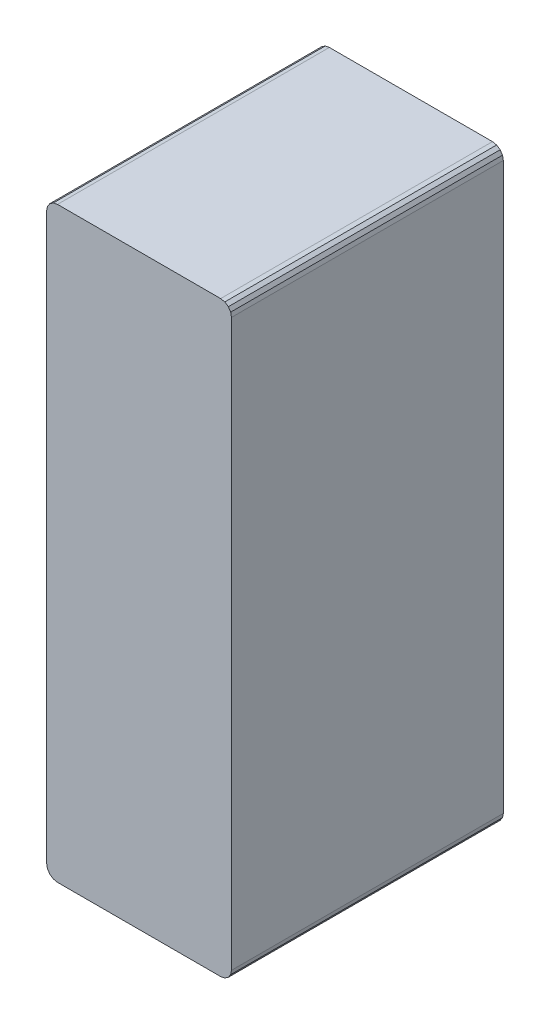
ISO-10303-21;
HEADER;
FILE_DESCRIPTION(('STEP AP214'),'2;1');
FILE_NAME('part.step','',(''),(''),'','','');
FILE_SCHEMA(('AUTOMOTIVE_DESIGN { 1 0 10303 214 1 1 1 1 }'));
ENDSEC;
DATA;
#1=APPLICATION_CONTEXT('core data for automotive mechanical design processes');
#2=APPLICATION_PROTOCOL_DEFINITION('international standard','automotive_design',2000,#1);
#3=PRODUCT_CONTEXT('',#1,'mechanical');
#4=PRODUCT('Part','Part','',(#3));
#5=PRODUCT_RELATED_PRODUCT_CATEGORY('part','',(#4));
#6=PRODUCT_DEFINITION_FORMATION('','',#4);
#7=PRODUCT_DEFINITION_CONTEXT('part definition',#1,'design');
#8=PRODUCT_DEFINITION('design','',#6,#7);
#9=PRODUCT_DEFINITION_SHAPE('','',#8);
#10=(LENGTH_UNIT() NAMED_UNIT(*) SI_UNIT(.MILLI.,.METRE.));
#11=(NAMED_UNIT(*) PLANE_ANGLE_UNIT() SI_UNIT($,.RADIAN.));
#12=(NAMED_UNIT(*) SI_UNIT($,.STERADIAN.) SOLID_ANGLE_UNIT());
#13=UNCERTAINTY_MEASURE_WITH_UNIT(LENGTH_MEASURE(1.E-05),#10,'distance_accuracy_value','');
#14=(GEOMETRIC_REPRESENTATION_CONTEXT(3) GLOBAL_UNCERTAINTY_ASSIGNED_CONTEXT((#13)) GLOBAL_UNIT_ASSIGNED_CONTEXT((#10,
#11,#12)) REPRESENTATION_CONTEXT('',''));
#15=CARTESIAN_POINT('',(0.,0.,0.));
#16=DIRECTION('',(0.,0.,1.));
#17=DIRECTION('',(1.,0.,0.));
#18=AXIS2_PLACEMENT_3D('',#15,#16,#17);
#19=CARTESIAN_POINT('',(17.,-52.,50.));
#20=DIRECTION('',(-1.,0.,0.));
#21=DIRECTION('',(0.,0.,1.));
#22=AXIS2_PLACEMENT_3D('',#19,#20,#21);
#23=PLANE('',#22);
#24=DIRECTION('',(0.,1.,0.));
#25=VECTOR('',#24,1.);
#26=CARTESIAN_POINT('',(17.,-52.,0.));
#27=LINE('',#26,#25);
#28=CARTESIAN_POINT('',(17.,-52.,0.));
#29=VERTEX_POINT('',#28);
#30=CARTESIAN_POINT('',(17.,52.,0.));
#31=VERTEX_POINT('',#30);
#32=EDGE_CURVE('E211',#29,#31,#27,.T.);
#33=ORIENTED_EDGE('',*,*,#32,.T.);
#34=DIRECTION('',(0.,0.,-1.));
#35=VECTOR('',#34,1.);
#36=CARTESIAN_POINT('',(17.,52.,50.));
#37=LINE('',#36,#35);
#38=CARTESIAN_POINT('',(17.,52.,50.));
#39=VERTEX_POINT('',#38);
#40=EDGE_CURVE('E11',#39,#31,#37,.T.);
#41=ORIENTED_EDGE('',*,*,#40,.F.);
#42=DIRECTION('',(0.,1.,0.));
#43=VECTOR('',#42,1.);
#44=CARTESIAN_POINT('',(17.,-52.,50.));
#45=LINE('',#44,#43);
#46=CARTESIAN_POINT('',(17.,-52.,50.));
#47=VERTEX_POINT('',#46);
#48=EDGE_CURVE('E249',#47,#39,#45,.T.);
#49=ORIENTED_EDGE('',*,*,#48,.F.);
#50=DIRECTION('',(0.,0.,-1.));
#51=VECTOR('',#50,1.);
#52=CARTESIAN_POINT('',(17.,-52.,50.));
#53=LINE('',#52,#51);
#54=EDGE_CURVE('E207',#47,#29,#53,.T.);
#55=ORIENTED_EDGE('',*,*,#54,.T.);
#56=EDGE_LOOP('',(#33,#41,#49,#55));
#57=FACE_BOUND('',#56,.T.);
#58=ADVANCED_FACE('F43',(#57),#23,.F.);
#59=CARTESIAN_POINT('',(17.,52.,50.));
#60=DIRECTION('',(-0.98078528040323,-0.195090322016131,0.));
#61=DIRECTION('',(0.195090322016131,-0.98078528040323,0.));
#62=AXIS2_PLACEMENT_3D('',#59,#60,#61);
#63=PLANE('',#62);
#64=DIRECTION('',(-0.195090322016131,0.98078528040323,0.));
#65=VECTOR('',#64,1.);
#66=CARTESIAN_POINT('',(17.,52.,0.));
#67=LINE('',#66,#65);
#68=CARTESIAN_POINT('',(16.8477590650226,52.7653668647302,0.));
#69=VERTEX_POINT('',#68);
#70=EDGE_CURVE('E214',#31,#69,#67,.T.);
#71=ORIENTED_EDGE('',*,*,#70,.T.);
#72=DIRECTION('',(0.,0.,-1.));
#73=VECTOR('',#72,1.);
#74=CARTESIAN_POINT('',(16.8477590650226,52.7653668647302,50.));
#75=LINE('',#74,#73);
#76=CARTESIAN_POINT('',(16.8477590650226,52.7653668647302,50.));
#77=VERTEX_POINT('',#76);
#78=EDGE_CURVE('E51',#77,#69,#75,.T.);
#79=ORIENTED_EDGE('',*,*,#78,.F.);
#80=DIRECTION('',(-0.195090322016131,0.98078528040323,0.));
#81=VECTOR('',#80,1.);
#82=CARTESIAN_POINT('',(17.,52.,50.));
#83=LINE('',#82,#81);
#84=EDGE_CURVE('E138',#39,#77,#83,.T.);
#85=ORIENTED_EDGE('',*,*,#84,.F.);
#86=ORIENTED_EDGE('',*,*,#40,.T.);
#87=EDGE_LOOP('',(#71,#79,#85,#86));
#88=FACE_BOUND('',#87,.T.);
#89=ADVANCED_FACE('F367',(#88),#63,.F.);
#90=CARTESIAN_POINT('',(16.8477590650226,52.7653668647302,50.));
#91=DIRECTION('',(-0.831469612302545,-0.555570233019602,0.));
#92=DIRECTION('',(0.555570233019602,-0.831469612302545,0.));
#93=AXIS2_PLACEMENT_3D('',#90,#91,#92);
#94=PLANE('',#93);
#95=DIRECTION('',(-0.555570233019602,0.831469612302545,0.));
#96=VECTOR('',#95,1.);
#97=CARTESIAN_POINT('',(16.8477590650226,52.7653668647302,0.));
#98=LINE('',#97,#96);
#99=CARTESIAN_POINT('',(16.4142135623731,53.4142135623731,0.));
#100=VERTEX_POINT('',#99);
#101=EDGE_CURVE('E216',#69,#100,#98,.T.);
#102=ORIENTED_EDGE('',*,*,#101,.T.);
#103=DIRECTION('',(0.,0.,-1.));
#104=VECTOR('',#103,1.);
#105=CARTESIAN_POINT('',(16.4142135623731,53.4142135623731,50.));
#106=LINE('',#105,#104);
#107=CARTESIAN_POINT('',(16.4142135623731,53.4142135623731,50.));
#108=VERTEX_POINT('',#107);
#109=EDGE_CURVE('E292',#108,#100,#106,.T.);
#110=ORIENTED_EDGE('',*,*,#109,.F.);
#111=DIRECTION('',(-0.555570233019602,0.831469612302545,0.));
#112=VECTOR('',#111,1.);
#113=CARTESIAN_POINT('',(16.8477590650226,52.7653668647302,50.));
#114=LINE('',#113,#112);
#115=EDGE_CURVE('E300',#77,#108,#114,.T.);
#116=ORIENTED_EDGE('',*,*,#115,.F.);
#117=ORIENTED_EDGE('',*,*,#78,.T.);
#118=EDGE_LOOP('',(#102,#110,#116,#117));
#119=FACE_BOUND('',#118,.T.);
#120=ADVANCED_FACE('F298',(#119),#94,.F.);
#121=CARTESIAN_POINT('',(16.4142135623731,53.4142135623731,50.));
#122=DIRECTION('',(-0.555570233019601,-0.831469612302546,0.));
#123=DIRECTION('',(0.831469612302546,-0.555570233019601,0.));
#124=AXIS2_PLACEMENT_3D('',#121,#122,#123);
#125=PLANE('',#124);
#126=DIRECTION('',(-0.831469612302546,0.555570233019601,0.));
#127=VECTOR('',#126,1.);
#128=CARTESIAN_POINT('',(16.4142135623731,53.4142135623731,0.));
#129=LINE('',#128,#127);
#130=CARTESIAN_POINT('',(15.7653668647302,53.8477590650226,0.));
#131=VERTEX_POINT('',#130);
#132=EDGE_CURVE('E218',#100,#131,#129,.T.);
#133=ORIENTED_EDGE('',*,*,#132,.T.);
#134=DIRECTION('',(0.,0.,-1.));
#135=VECTOR('',#134,1.);
#136=CARTESIAN_POINT('',(15.7653668647302,53.8477590650226,50.));
#137=LINE('',#136,#135);
#138=CARTESIAN_POINT('',(15.7653668647302,53.8477590650226,50.));
#139=VERTEX_POINT('',#138);
#140=EDGE_CURVE('E289',#139,#131,#137,.T.);
#141=ORIENTED_EDGE('',*,*,#140,.F.);
#142=DIRECTION('',(-0.831469612302546,0.555570233019601,0.));
#143=VECTOR('',#142,1.);
#144=CARTESIAN_POINT('',(16.4142135623731,53.4142135623731,50.));
#145=LINE('',#144,#143);
#146=EDGE_CURVE('E318',#108,#139,#145,.T.);
#147=ORIENTED_EDGE('',*,*,#146,.F.);
#148=ORIENTED_EDGE('',*,*,#109,.T.);
#149=EDGE_LOOP('',(#133,#141,#147,#148));
#150=FACE_BOUND('',#149,.T.);
#151=ADVANCED_FACE('F309',(#150),#125,.F.);
#152=CARTESIAN_POINT('',(15.7653668647302,53.8477590650226,50.));
#153=DIRECTION('',(-0.195090322016129,-0.98078528040323,0.));
#154=DIRECTION('',(0.98078528040323,-0.195090322016129,0.));
#155=AXIS2_PLACEMENT_3D('',#152,#153,#154);
#156=PLANE('',#155);
#157=DIRECTION('',(-0.98078528040323,0.195090322016129,0.));
#158=VECTOR('',#157,1.);
#159=CARTESIAN_POINT('',(15.7653668647302,53.8477590650226,0.));
#160=LINE('',#159,#158);
#161=CARTESIAN_POINT('',(15.,54.,0.));
#162=VERTEX_POINT('',#161);
#163=EDGE_CURVE('E220',#131,#162,#160,.T.);
#164=ORIENTED_EDGE('',*,*,#163,.T.);
#165=DIRECTION('',(0.,0.,-1.));
#166=VECTOR('',#165,1.);
#167=CARTESIAN_POINT('',(15.,54.,50.));
#168=LINE('',#167,#166);
#169=CARTESIAN_POINT('',(15.,54.,50.));
#170=VERTEX_POINT('',#169);
#171=EDGE_CURVE('E286',#170,#162,#168,.T.);
#172=ORIENTED_EDGE('',*,*,#171,.F.);
#173=DIRECTION('',(-0.98078528040323,0.195090322016129,0.));
#174=VECTOR('',#173,1.);
#175=CARTESIAN_POINT('',(15.7653668647302,53.8477590650226,50.));
#176=LINE('',#175,#174);
#177=EDGE_CURVE('E315',#139,#170,#176,.T.);
#178=ORIENTED_EDGE('',*,*,#177,.F.);
#179=ORIENTED_EDGE('',*,*,#140,.T.);
#180=EDGE_LOOP('',(#164,#172,#178,#179));
#181=FACE_BOUND('',#180,.T.);
#182=ADVANCED_FACE('F313',(#181),#156,.F.);
#183=CARTESIAN_POINT('',(15.,54.,50.));
#184=DIRECTION('',(0.,-1.,0.));
#185=DIRECTION('',(0.,0.,-1.));
#186=AXIS2_PLACEMENT_3D('',#183,#184,#185);
#187=PLANE('',#186);
#188=DIRECTION('',(-1.,0.,0.));
#189=VECTOR('',#188,1.);
#190=CARTESIAN_POINT('',(15.,54.,0.));
#191=LINE('',#190,#189);
#192=CARTESIAN_POINT('',(-15.,54.,0.));
#193=VERTEX_POINT('',#192);
#194=EDGE_CURVE('E222',#162,#193,#191,.T.);
#195=ORIENTED_EDGE('',*,*,#194,.T.);
#196=DIRECTION('',(0.,0.,-1.));
#197=VECTOR('',#196,1.);
#198=CARTESIAN_POINT('',(-15.,54.,50.));
#199=LINE('',#198,#197);
#200=CARTESIAN_POINT('',(-15.,54.,50.));
#201=VERTEX_POINT('',#200);
#202=EDGE_CURVE('E283',#201,#193,#199,.T.);
#203=ORIENTED_EDGE('',*,*,#202,.F.);
#204=DIRECTION('',(-1.,0.,0.));
#205=VECTOR('',#204,1.);
#206=CARTESIAN_POINT('',(15.,54.,50.));
#207=LINE('',#206,#205);
#208=EDGE_CURVE('E317',#170,#201,#207,.T.);
#209=ORIENTED_EDGE('',*,*,#208,.F.);
#210=ORIENTED_EDGE('',*,*,#171,.T.);
#211=EDGE_LOOP('',(#195,#203,#209,#210));
#212=FACE_BOUND('',#211,.T.);
#213=ADVANCED_FACE('F380',(#212),#187,.F.);
#214=CARTESIAN_POINT('',(-15.,54.,50.));
#215=DIRECTION('',(0.195090322016129,-0.98078528040323,0.));
#216=DIRECTION('',(0.98078528040323,0.195090322016129,0.));
#217=AXIS2_PLACEMENT_3D('',#214,#215,#216);
#218=PLANE('',#217);
#219=DIRECTION('',(-0.98078528040323,-0.195090322016129,0.));
#220=VECTOR('',#219,1.);
#221=CARTESIAN_POINT('',(-15.,54.,0.));
#222=LINE('',#221,#220);
#223=CARTESIAN_POINT('',(-15.7653668647302,53.8477590650226,0.));
#224=VERTEX_POINT('',#223);
#225=EDGE_CURVE('E224',#193,#224,#222,.T.);
#226=ORIENTED_EDGE('',*,*,#225,.T.);
#227=DIRECTION('',(0.,0.,-1.));
#228=VECTOR('',#227,1.);
#229=CARTESIAN_POINT('',(-15.7653668647302,53.8477590650226,50.));
#230=LINE('',#229,#228);
#231=CARTESIAN_POINT('',(-15.7653668647302,53.8477590650226,50.));
#232=VERTEX_POINT('',#231);
#233=EDGE_CURVE('E280',#232,#224,#230,.T.);
#234=ORIENTED_EDGE('',*,*,#233,.F.);
#235=DIRECTION('',(-0.98078528040323,-0.195090322016129,0.));
#236=VECTOR('',#235,1.);
#237=CARTESIAN_POINT('',(-15.,54.,50.));
#238=LINE('',#237,#236);
#239=EDGE_CURVE('E320',#201,#232,#238,.T.);
#240=ORIENTED_EDGE('',*,*,#239,.F.);
#241=ORIENTED_EDGE('',*,*,#202,.T.);
#242=EDGE_LOOP('',(#226,#234,#240,#241));
#243=FACE_BOUND('',#242,.T.);
#244=ADVANCED_FACE('F383',(#243),#218,.F.);
#245=CARTESIAN_POINT('',(-15.7653668647302,53.8477590650226,50.));
#246=DIRECTION('',(0.555570233019601,-0.831469612302546,0.));
#247=DIRECTION('',(0.831469612302546,0.555570233019601,0.));
#248=AXIS2_PLACEMENT_3D('',#245,#246,#247);
#249=PLANE('',#248);
#250=DIRECTION('',(-0.831469612302546,-0.555570233019601,0.));
#251=VECTOR('',#250,1.);
#252=CARTESIAN_POINT('',(-15.7653668647302,53.8477590650226,0.));
#253=LINE('',#252,#251);
#254=CARTESIAN_POINT('',(-16.4142135623731,53.4142135623731,0.));
#255=VERTEX_POINT('',#254);
#256=EDGE_CURVE('E226',#224,#255,#253,.T.);
#257=ORIENTED_EDGE('',*,*,#256,.T.);
#258=DIRECTION('',(0.,0.,-1.));
#259=VECTOR('',#258,1.);
#260=CARTESIAN_POINT('',(-16.4142135623731,53.4142135623731,50.));
#261=LINE('',#260,#259);
#262=CARTESIAN_POINT('',(-16.4142135623731,53.4142135623731,50.));
#263=VERTEX_POINT('',#262);
#264=EDGE_CURVE('E277',#263,#255,#261,.T.);
#265=ORIENTED_EDGE('',*,*,#264,.F.);
#266=DIRECTION('',(-0.831469612302546,-0.555570233019601,0.));
#267=VECTOR('',#266,1.);
#268=CARTESIAN_POINT('',(-15.7653668647302,53.8477590650226,50.));
#269=LINE('',#268,#267);
#270=EDGE_CURVE('E326',#232,#263,#269,.T.);
#271=ORIENTED_EDGE('',*,*,#270,.F.);
#272=ORIENTED_EDGE('',*,*,#233,.T.);
#273=EDGE_LOOP('',(#257,#265,#271,#272));
#274=FACE_BOUND('',#273,.T.);
#275=ADVANCED_FACE('F387',(#274),#249,.F.);
#276=CARTESIAN_POINT('',(-16.4142135623731,53.4142135623731,50.));
#277=DIRECTION('',(0.831469612302545,-0.555570233019602,0.));
#278=DIRECTION('',(0.555570233019602,0.831469612302545,0.));
#279=AXIS2_PLACEMENT_3D('',#276,#277,#278);
#280=PLANE('',#279);
#281=DIRECTION('',(-0.555570233019602,-0.831469612302545,0.));
#282=VECTOR('',#281,1.);
#283=CARTESIAN_POINT('',(-16.4142135623731,53.4142135623731,0.));
#284=LINE('',#283,#282);
#285=CARTESIAN_POINT('',(-16.8477590650226,52.7653668647302,0.));
#286=VERTEX_POINT('',#285);
#287=EDGE_CURVE('E228',#255,#286,#284,.T.);
#288=ORIENTED_EDGE('',*,*,#287,.T.);
#289=DIRECTION('',(0.,0.,-1.));
#290=VECTOR('',#289,1.);
#291=CARTESIAN_POINT('',(-16.8477590650226,52.7653668647302,50.));
#292=LINE('',#291,#290);
#293=CARTESIAN_POINT('',(-16.8477590650226,52.7653668647302,50.));
#294=VERTEX_POINT('',#293);
#295=EDGE_CURVE('E274',#294,#286,#292,.T.);
#296=ORIENTED_EDGE('',*,*,#295,.F.);
#297=DIRECTION('',(-0.555570233019602,-0.831469612302545,0.));
#298=VECTOR('',#297,1.);
#299=CARTESIAN_POINT('',(-16.4142135623731,53.4142135623731,50.));
#300=LINE('',#299,#298);
#301=EDGE_CURVE('E328',#263,#294,#300,.T.);
#302=ORIENTED_EDGE('',*,*,#301,.F.);
#303=ORIENTED_EDGE('',*,*,#264,.T.);
#304=EDGE_LOOP('',(#288,#296,#302,#303));
#305=FACE_BOUND('',#304,.T.);
#306=ADVANCED_FACE('F391',(#305),#280,.F.);
#307=CARTESIAN_POINT('',(-16.8477590650226,52.7653668647302,50.));
#308=DIRECTION('',(0.98078528040323,-0.195090322016131,0.));
#309=DIRECTION('',(0.195090322016131,0.98078528040323,0.));
#310=AXIS2_PLACEMENT_3D('',#307,#308,#309);
#311=PLANE('',#310);
#312=DIRECTION('',(-0.195090322016131,-0.98078528040323,0.));
#313=VECTOR('',#312,1.);
#314=CARTESIAN_POINT('',(-16.8477590650226,52.7653668647302,0.));
#315=LINE('',#314,#313);
#316=CARTESIAN_POINT('',(-17.,52.,0.));
#317=VERTEX_POINT('',#316);
#318=EDGE_CURVE('E230',#286,#317,#315,.T.);
#319=ORIENTED_EDGE('',*,*,#318,.T.);
#320=DIRECTION('',(0.,0.,-1.));
#321=VECTOR('',#320,1.);
#322=CARTESIAN_POINT('',(-17.,52.,50.));
#323=LINE('',#322,#321);
#324=CARTESIAN_POINT('',(-17.,52.,50.));
#325=VERTEX_POINT('',#324);
#326=EDGE_CURVE('E271',#325,#317,#323,.T.);
#327=ORIENTED_EDGE('',*,*,#326,.F.);
#328=DIRECTION('',(-0.195090322016131,-0.98078528040323,0.));
#329=VECTOR('',#328,1.);
#330=CARTESIAN_POINT('',(-16.8477590650226,52.7653668647302,50.));
#331=LINE('',#330,#329);
#332=EDGE_CURVE('E330',#294,#325,#331,.T.);
#333=ORIENTED_EDGE('',*,*,#332,.F.);
#334=ORIENTED_EDGE('',*,*,#295,.T.);
#335=EDGE_LOOP('',(#319,#327,#333,#334));
#336=FACE_BOUND('',#335,.T.);
#337=ADVANCED_FACE('F395',(#336),#311,.F.);
#338=CARTESIAN_POINT('',(-17.,52.,50.));
#339=DIRECTION('',(1.,0.,0.));
#340=DIRECTION('',(0.,0.,-1.));
#341=AXIS2_PLACEMENT_3D('',#338,#339,#340);
#342=PLANE('',#341);
#343=DIRECTION('',(0.,-1.,0.));
#344=VECTOR('',#343,1.);
#345=CARTESIAN_POINT('',(-17.,52.,0.));
#346=LINE('',#345,#344);
#347=CARTESIAN_POINT('',(-17.,-52.,0.));
#348=VERTEX_POINT('',#347);
#349=EDGE_CURVE('E232',#317,#348,#346,.T.);
#350=ORIENTED_EDGE('',*,*,#349,.T.);
#351=DIRECTION('',(0.,0.,-1.));
#352=VECTOR('',#351,1.);
#353=CARTESIAN_POINT('',(-17.,-52.,50.));
#354=LINE('',#353,#352);
#355=CARTESIAN_POINT('',(-17.,-52.,50.));
#356=VERTEX_POINT('',#355);
#357=EDGE_CURVE('E268',#356,#348,#354,.T.);
#358=ORIENTED_EDGE('',*,*,#357,.F.);
#359=DIRECTION('',(0.,-1.,0.));
#360=VECTOR('',#359,1.);
#361=CARTESIAN_POINT('',(-17.,52.,50.));
#362=LINE('',#361,#360);
#363=EDGE_CURVE('E332',#325,#356,#362,.T.);
#364=ORIENTED_EDGE('',*,*,#363,.F.);
#365=ORIENTED_EDGE('',*,*,#326,.T.);
#366=EDGE_LOOP('',(#350,#358,#364,#365));
#367=FACE_BOUND('',#366,.T.);
#368=ADVANCED_FACE('F399',(#367),#342,.F.);
#369=CARTESIAN_POINT('',(-17.,-52.,50.));
#370=DIRECTION('',(0.98078528040323,0.195090322016131,0.));
#371=DIRECTION('',(-0.195090322016131,0.98078528040323,0.));
#372=AXIS2_PLACEMENT_3D('',#369,#370,#371);
#373=PLANE('',#372);
#374=DIRECTION('',(0.195090322016131,-0.98078528040323,0.));
#375=VECTOR('',#374,1.);
#376=CARTESIAN_POINT('',(-17.,-52.,0.));
#377=LINE('',#376,#375);
#378=CARTESIAN_POINT('',(-16.8477590650226,-52.7653668647302,0.));
#379=VERTEX_POINT('',#378);
#380=EDGE_CURVE('E234',#348,#379,#377,.T.);
#381=ORIENTED_EDGE('',*,*,#380,.T.);
#382=DIRECTION('',(0.,0.,-1.));
#383=VECTOR('',#382,1.);
#384=CARTESIAN_POINT('',(-16.8477590650226,-52.7653668647302,50.));
#385=LINE('',#384,#383);
#386=CARTESIAN_POINT('',(-16.8477590650226,-52.7653668647302,50.));
#387=VERTEX_POINT('',#386);
#388=EDGE_CURVE('E265',#387,#379,#385,.T.);
#389=ORIENTED_EDGE('',*,*,#388,.F.);
#390=DIRECTION('',(0.195090322016131,-0.98078528040323,0.));
#391=VECTOR('',#390,1.);
#392=CARTESIAN_POINT('',(-17.,-52.,50.));
#393=LINE('',#392,#391);
#394=EDGE_CURVE('E334',#356,#387,#393,.T.);
#395=ORIENTED_EDGE('',*,*,#394,.F.);
#396=ORIENTED_EDGE('',*,*,#357,.T.);
#397=EDGE_LOOP('',(#381,#389,#395,#396));
#398=FACE_BOUND('',#397,.T.);
#399=ADVANCED_FACE('F403',(#398),#373,.F.);
#400=CARTESIAN_POINT('',(-16.8477590650226,-52.7653668647302,50.));
#401=DIRECTION('',(0.831469612302545,0.555570233019602,0.));
#402=DIRECTION('',(-0.555570233019602,0.831469612302545,0.));
#403=AXIS2_PLACEMENT_3D('',#400,#401,#402);
#404=PLANE('',#403);
#405=DIRECTION('',(0.555570233019602,-0.831469612302545,0.));
#406=VECTOR('',#405,1.);
#407=CARTESIAN_POINT('',(-16.8477590650226,-52.7653668647302,0.));
#408=LINE('',#407,#406);
#409=CARTESIAN_POINT('',(-16.4142135623731,-53.4142135623731,0.));
#410=VERTEX_POINT('',#409);
#411=EDGE_CURVE('E236',#379,#410,#408,.T.);
#412=ORIENTED_EDGE('',*,*,#411,.T.);
#413=DIRECTION('',(0.,0.,-1.));
#414=VECTOR('',#413,1.);
#415=CARTESIAN_POINT('',(-16.4142135623731,-53.4142135623731,50.));
#416=LINE('',#415,#414);
#417=CARTESIAN_POINT('',(-16.4142135623731,-53.4142135623731,50.));
#418=VERTEX_POINT('',#417);
#419=EDGE_CURVE('E262',#418,#410,#416,.T.);
#420=ORIENTED_EDGE('',*,*,#419,.F.);
#421=DIRECTION('',(0.555570233019602,-0.831469612302545,0.));
#422=VECTOR('',#421,1.);
#423=CARTESIAN_POINT('',(-16.8477590650226,-52.7653668647302,50.));
#424=LINE('',#423,#422);
#425=EDGE_CURVE('E336',#387,#418,#424,.T.);
#426=ORIENTED_EDGE('',*,*,#425,.F.);
#427=ORIENTED_EDGE('',*,*,#388,.T.);
#428=EDGE_LOOP('',(#412,#420,#426,#427));
#429=FACE_BOUND('',#428,.T.);
#430=ADVANCED_FACE('F407',(#429),#404,.F.);
#431=CARTESIAN_POINT('',(-16.4142135623731,-53.4142135623731,50.));
#432=DIRECTION('',(0.555570233019601,0.831469612302546,0.));
#433=DIRECTION('',(-0.831469612302546,0.555570233019601,0.));
#434=AXIS2_PLACEMENT_3D('',#431,#432,#433);
#435=PLANE('',#434);
#436=DIRECTION('',(0.831469612302546,-0.555570233019601,0.));
#437=VECTOR('',#436,1.);
#438=CARTESIAN_POINT('',(-16.4142135623731,-53.4142135623731,0.));
#439=LINE('',#438,#437);
#440=CARTESIAN_POINT('',(-15.7653668647302,-53.8477590650226,0.));
#441=VERTEX_POINT('',#440);
#442=EDGE_CURVE('E238',#410,#441,#439,.T.);
#443=ORIENTED_EDGE('',*,*,#442,.T.);
#444=DIRECTION('',(0.,0.,-1.));
#445=VECTOR('',#444,1.);
#446=CARTESIAN_POINT('',(-15.7653668647302,-53.8477590650226,50.));
#447=LINE('',#446,#445);
#448=CARTESIAN_POINT('',(-15.7653668647302,-53.8477590650226,50.));
#449=VERTEX_POINT('',#448);
#450=EDGE_CURVE('E259',#449,#441,#447,.T.);
#451=ORIENTED_EDGE('',*,*,#450,.F.);
#452=DIRECTION('',(0.831469612302546,-0.555570233019601,0.));
#453=VECTOR('',#452,1.);
#454=CARTESIAN_POINT('',(-16.4142135623731,-53.4142135623731,50.));
#455=LINE('',#454,#453);
#456=EDGE_CURVE('E338',#418,#449,#455,.T.);
#457=ORIENTED_EDGE('',*,*,#456,.F.);
#458=ORIENTED_EDGE('',*,*,#419,.T.);
#459=EDGE_LOOP('',(#443,#451,#457,#458));
#460=FACE_BOUND('',#459,.T.);
#461=ADVANCED_FACE('F411',(#460),#435,.F.);
#462=CARTESIAN_POINT('',(-15.7653668647302,-53.8477590650226,50.));
#463=DIRECTION('',(0.195090322016129,0.98078528040323,0.));
#464=DIRECTION('',(-0.98078528040323,0.195090322016129,0.));
#465=AXIS2_PLACEMENT_3D('',#462,#463,#464);
#466=PLANE('',#465);
#467=DIRECTION('',(0.98078528040323,-0.195090322016129,0.));
#468=VECTOR('',#467,1.);
#469=CARTESIAN_POINT('',(-15.7653668647302,-53.8477590650226,0.));
#470=LINE('',#469,#468);
#471=CARTESIAN_POINT('',(-15.,-54.,0.));
#472=VERTEX_POINT('',#471);
#473=EDGE_CURVE('E240',#441,#472,#470,.T.);
#474=ORIENTED_EDGE('',*,*,#473,.T.);
#475=DIRECTION('',(0.,0.,-1.));
#476=VECTOR('',#475,1.);
#477=CARTESIAN_POINT('',(-15.,-54.,50.));
#478=LINE('',#477,#476);
#479=CARTESIAN_POINT('',(-15.,-54.,50.));
#480=VERTEX_POINT('',#479);
#481=EDGE_CURVE('E256',#480,#472,#478,.T.);
#482=ORIENTED_EDGE('',*,*,#481,.F.);
#483=DIRECTION('',(0.98078528040323,-0.195090322016129,0.));
#484=VECTOR('',#483,1.);
#485=CARTESIAN_POINT('',(-15.7653668647302,-53.8477590650226,50.));
#486=LINE('',#485,#484);
#487=EDGE_CURVE('E340',#449,#480,#486,.T.);
#488=ORIENTED_EDGE('',*,*,#487,.F.);
#489=ORIENTED_EDGE('',*,*,#450,.T.);
#490=EDGE_LOOP('',(#474,#482,#488,#489));
#491=FACE_BOUND('',#490,.T.);
#492=ADVANCED_FACE('F415',(#491),#466,.F.);
#493=CARTESIAN_POINT('',(-15.,-54.,50.));
#494=DIRECTION('',(0.,1.,0.));
#495=DIRECTION('',(0.,0.,1.));
#496=AXIS2_PLACEMENT_3D('',#493,#494,#495);
#497=PLANE('',#496);
#498=DIRECTION('',(1.,0.,0.));
#499=VECTOR('',#498,1.);
#500=CARTESIAN_POINT('',(-15.,-54.,0.));
#501=LINE('',#500,#499);
#502=CARTESIAN_POINT('',(15.,-54.,0.));
#503=VERTEX_POINT('',#502);
#504=EDGE_CURVE('E242',#472,#503,#501,.T.);
#505=ORIENTED_EDGE('',*,*,#504,.T.);
#506=DIRECTION('',(0.,0.,-1.));
#507=VECTOR('',#506,1.);
#508=CARTESIAN_POINT('',(15.,-54.,50.));
#509=LINE('',#508,#507);
#510=CARTESIAN_POINT('',(15.,-54.,50.));
#511=VERTEX_POINT('',#510);
#512=EDGE_CURVE('E253',#511,#503,#509,.T.);
#513=ORIENTED_EDGE('',*,*,#512,.F.);
#514=DIRECTION('',(1.,0.,0.));
#515=VECTOR('',#514,1.);
#516=CARTESIAN_POINT('',(-15.,-54.,50.));
#517=LINE('',#516,#515);
#518=EDGE_CURVE('E342',#480,#511,#517,.T.);
#519=ORIENTED_EDGE('',*,*,#518,.F.);
#520=ORIENTED_EDGE('',*,*,#481,.T.);
#521=EDGE_LOOP('',(#505,#513,#519,#520));
#522=FACE_BOUND('',#521,.T.);
#523=ADVANCED_FACE('F348',(#522),#497,.F.);
#524=CARTESIAN_POINT('',(15.,-54.,50.));
#525=DIRECTION('',(-0.195090322016129,0.98078528040323,0.));
#526=DIRECTION('',(-0.98078528040323,-0.195090322016129,0.));
#527=AXIS2_PLACEMENT_3D('',#524,#525,#526);
#528=PLANE('',#527);
#529=DIRECTION('',(0.98078528040323,0.195090322016129,0.));
#530=VECTOR('',#529,1.);
#531=CARTESIAN_POINT('',(15.,-54.,0.));
#532=LINE('',#531,#530);
#533=CARTESIAN_POINT('',(15.7653668647302,-53.8477590650226,0.));
#534=VERTEX_POINT('',#533);
#535=EDGE_CURVE('E244',#503,#534,#532,.T.);
#536=ORIENTED_EDGE('',*,*,#535,.T.);
#537=DIRECTION('',(0.,0.,-1.));
#538=VECTOR('',#537,1.);
#539=CARTESIAN_POINT('',(15.7653668647302,-53.8477590650226,50.));
#540=LINE('',#539,#538);
#541=CARTESIAN_POINT('',(15.7653668647302,-53.8477590650226,50.));
#542=VERTEX_POINT('',#541);
#543=EDGE_CURVE('E202',#542,#534,#540,.T.);
#544=ORIENTED_EDGE('',*,*,#543,.F.);
#545=DIRECTION('',(0.98078528040323,0.195090322016129,0.));
#546=VECTOR('',#545,1.);
#547=CARTESIAN_POINT('',(15.,-54.,50.));
#548=LINE('',#547,#546);
#549=EDGE_CURVE('E193',#511,#542,#548,.T.);
#550=ORIENTED_EDGE('',*,*,#549,.F.);
#551=ORIENTED_EDGE('',*,*,#512,.T.);
#552=EDGE_LOOP('',(#536,#544,#550,#551));
#553=FACE_BOUND('',#552,.T.);
#554=ADVANCED_FACE('F352',(#553),#528,.F.);
#555=CARTESIAN_POINT('',(15.7653668647302,-53.8477590650226,50.));
#556=DIRECTION('',(-0.555570233019601,0.831469612302546,0.));
#557=DIRECTION('',(-0.831469612302546,-0.555570233019601,0.));
#558=AXIS2_PLACEMENT_3D('',#555,#556,#557);
#559=PLANE('',#558);
#560=DIRECTION('',(0.831469612302546,0.555570233019601,0.));
#561=VECTOR('',#560,1.);
#562=CARTESIAN_POINT('',(15.7653668647302,-53.8477590650226,0.));
#563=LINE('',#562,#561);
#564=CARTESIAN_POINT('',(16.4142135623731,-53.4142135623731,0.));
#565=VERTEX_POINT('',#564);
#566=EDGE_CURVE('E201',#534,#565,#563,.T.);
#567=ORIENTED_EDGE('',*,*,#566,.T.);
#568=DIRECTION('',(0.,0.,-1.));
#569=VECTOR('',#568,1.);
#570=CARTESIAN_POINT('',(16.4142135623731,-53.4142135623731,50.));
#571=LINE('',#570,#569);
#572=CARTESIAN_POINT('',(16.4142135623731,-53.4142135623731,50.));
#573=VERTEX_POINT('',#572);
#574=EDGE_CURVE('E198',#573,#565,#571,.T.);
#575=ORIENTED_EDGE('',*,*,#574,.F.);
#576=DIRECTION('',(0.831469612302546,0.555570233019601,0.));
#577=VECTOR('',#576,1.);
#578=CARTESIAN_POINT('',(15.7653668647302,-53.8477590650226,50.));
#579=LINE('',#578,#577);
#580=EDGE_CURVE('E187',#542,#573,#579,.T.);
#581=ORIENTED_EDGE('',*,*,#580,.F.);
#582=ORIENTED_EDGE('',*,*,#543,.T.);
#583=EDGE_LOOP('',(#567,#575,#581,#582));
#584=FACE_BOUND('',#583,.T.);
#585=ADVANCED_FACE('F199',(#584),#559,.F.);
#586=CARTESIAN_POINT('',(16.4142135623731,-53.4142135623731,50.));
#587=DIRECTION('',(-0.831469612302548,0.555570233019598,0.));
#588=DIRECTION('',(-0.555570233019598,-0.831469612302548,0.));
#589=AXIS2_PLACEMENT_3D('',#586,#587,#588);
#590=PLANE('',#589);
#591=DIRECTION('',(0.555570233019598,0.831469612302548,0.));
#592=VECTOR('',#591,1.);
#593=CARTESIAN_POINT('',(16.4142135623731,-53.4142135623731,0.));
#594=LINE('',#593,#592);
#595=CARTESIAN_POINT('',(16.8477590650226,-52.7653668647302,0.));
#596=VERTEX_POINT('',#595);
#597=EDGE_CURVE('E124',#565,#596,#594,.T.);
#598=ORIENTED_EDGE('',*,*,#597,.T.);
#599=DIRECTION('',(0.,0.,-1.));
#600=VECTOR('',#599,1.);
#601=CARTESIAN_POINT('',(16.8477590650226,-52.7653668647302,50.));
#602=LINE('',#601,#600);
#603=CARTESIAN_POINT('',(16.8477590650226,-52.7653668647302,50.));
#604=VERTEX_POINT('',#603);
#605=EDGE_CURVE('E203',#604,#596,#602,.T.);
#606=ORIENTED_EDGE('',*,*,#605,.F.);
#607=DIRECTION('',(0.555570233019598,0.831469612302548,0.));
#608=VECTOR('',#607,1.);
#609=CARTESIAN_POINT('',(16.4142135623731,-53.4142135623731,50.));
#610=LINE('',#609,#608);
#611=EDGE_CURVE('E191',#573,#604,#610,.T.);
#612=ORIENTED_EDGE('',*,*,#611,.F.);
#613=ORIENTED_EDGE('',*,*,#574,.T.);
#614=EDGE_LOOP('',(#598,#606,#612,#613));
#615=FACE_BOUND('',#614,.T.);
#616=ADVANCED_FACE('F205',(#615),#590,.F.);
#617=CARTESIAN_POINT('',(16.8477590650226,-52.7653668647302,50.));
#618=DIRECTION('',(-0.98078528040323,0.195090322016133,0.));
#619=DIRECTION('',(-0.195090322016133,-0.98078528040323,0.));
#620=AXIS2_PLACEMENT_3D('',#617,#618,#619);
#621=PLANE('',#620);
#622=DIRECTION('',(0.195090322016133,0.98078528040323,0.));
#623=VECTOR('',#622,1.);
#624=CARTESIAN_POINT('',(16.8477590650226,-52.7653668647302,0.));
#625=LINE('',#624,#623);
#626=EDGE_CURVE('E130',#596,#29,#625,.T.);
#627=ORIENTED_EDGE('',*,*,#626,.T.);
#628=ORIENTED_EDGE('',*,*,#54,.F.);
#629=DIRECTION('',(0.195090322016133,0.98078528040323,0.));
#630=VECTOR('',#629,1.);
#631=CARTESIAN_POINT('',(16.8477590650226,-52.7653668647302,50.));
#632=LINE('',#631,#630);
#633=EDGE_CURVE('E59',#604,#47,#632,.T.);
#634=ORIENTED_EDGE('',*,*,#633,.F.);
#635=ORIENTED_EDGE('',*,*,#605,.T.);
#636=EDGE_LOOP('',(#627,#628,#634,#635));
#637=FACE_BOUND('',#636,.T.);
#638=ADVANCED_FACE('F356',(#637),#621,.F.);
#639=CARTESIAN_POINT('',(0.,0.,50.));
#640=DIRECTION('',(0.,0.,1.));
#641=DIRECTION('',(1.,0.,0.));
#642=AXIS2_PLACEMENT_3D('',#639,#640,#641);
#643=PLANE('',#642);
#644=ORIENTED_EDGE('',*,*,#48,.T.);
#645=ORIENTED_EDGE('',*,*,#84,.T.);
#646=ORIENTED_EDGE('',*,*,#115,.T.);
#647=ORIENTED_EDGE('',*,*,#146,.T.);
#648=ORIENTED_EDGE('',*,*,#177,.T.);
#649=ORIENTED_EDGE('',*,*,#208,.T.);
#650=ORIENTED_EDGE('',*,*,#239,.T.);
#651=ORIENTED_EDGE('',*,*,#270,.T.);
#652=ORIENTED_EDGE('',*,*,#301,.T.);
#653=ORIENTED_EDGE('',*,*,#332,.T.);
#654=ORIENTED_EDGE('',*,*,#363,.T.);
#655=ORIENTED_EDGE('',*,*,#394,.T.);
#656=ORIENTED_EDGE('',*,*,#425,.T.);
#657=ORIENTED_EDGE('',*,*,#456,.T.);
#658=ORIENTED_EDGE('',*,*,#487,.T.);
#659=ORIENTED_EDGE('',*,*,#518,.T.);
#660=ORIENTED_EDGE('',*,*,#549,.T.);
#661=ORIENTED_EDGE('',*,*,#580,.T.);
#662=ORIENTED_EDGE('',*,*,#611,.T.);
#663=ORIENTED_EDGE('',*,*,#633,.T.);
#664=EDGE_LOOP('',(#644,#645,#646,#647,#648,#649,#650,#651,#652,#653,#654,#655,#656,#657,#658,
#659,#660,#661,#662,#663));
#665=FACE_BOUND('',#664,.T.);
#666=ADVANCED_FACE('F189',(#665),#643,.T.);
#667=CARTESIAN_POINT('',(0.,0.,0.));
#668=DIRECTION('',(0.,0.,1.));
#669=DIRECTION('',(1.,0.,0.));
#670=AXIS2_PLACEMENT_3D('',#667,#668,#669);
#671=PLANE('',#670);
#672=ORIENTED_EDGE('',*,*,#32,.F.);
#673=ORIENTED_EDGE('',*,*,#626,.F.);
#674=ORIENTED_EDGE('',*,*,#597,.F.);
#675=ORIENTED_EDGE('',*,*,#566,.F.);
#676=ORIENTED_EDGE('',*,*,#535,.F.);
#677=ORIENTED_EDGE('',*,*,#504,.F.);
#678=ORIENTED_EDGE('',*,*,#473,.F.);
#679=ORIENTED_EDGE('',*,*,#442,.F.);
#680=ORIENTED_EDGE('',*,*,#411,.F.);
#681=ORIENTED_EDGE('',*,*,#380,.F.);
#682=ORIENTED_EDGE('',*,*,#349,.F.);
#683=ORIENTED_EDGE('',*,*,#318,.F.);
#684=ORIENTED_EDGE('',*,*,#287,.F.);
#685=ORIENTED_EDGE('',*,*,#256,.F.);
#686=ORIENTED_EDGE('',*,*,#225,.F.);
#687=ORIENTED_EDGE('',*,*,#194,.F.);
#688=ORIENTED_EDGE('',*,*,#163,.F.);
#689=ORIENTED_EDGE('',*,*,#132,.F.);
#690=ORIENTED_EDGE('',*,*,#101,.F.);
#691=ORIENTED_EDGE('',*,*,#70,.F.);
#692=EDGE_LOOP('',(#672,#673,#674,#675,#676,#677,#678,#679,#680,#681,#682,#683,#684,#685,#686,
#687,#688,#689,#690,#691));
#693=FACE_BOUND('',#692,.T.);
#694=ADVANCED_FACE('F304',(#693),#671,.F.);
#695=CLOSED_SHELL('',(#58,#89,#120,#151,#182,#213,#244,#275,#306,#337,#368,#399,#430,#461,#492,
#523,#554,#585,#616,#638,#666,#694));
#696=MANIFOLD_SOLID_BREP('B2',#695);
#697=ADVANCED_BREP_SHAPE_REPRESENTATION('',(#18,#696),#14);
#698=SHAPE_DEFINITION_REPRESENTATION(#9,#697);
ENDSEC;
END-ISO-10303-21;
